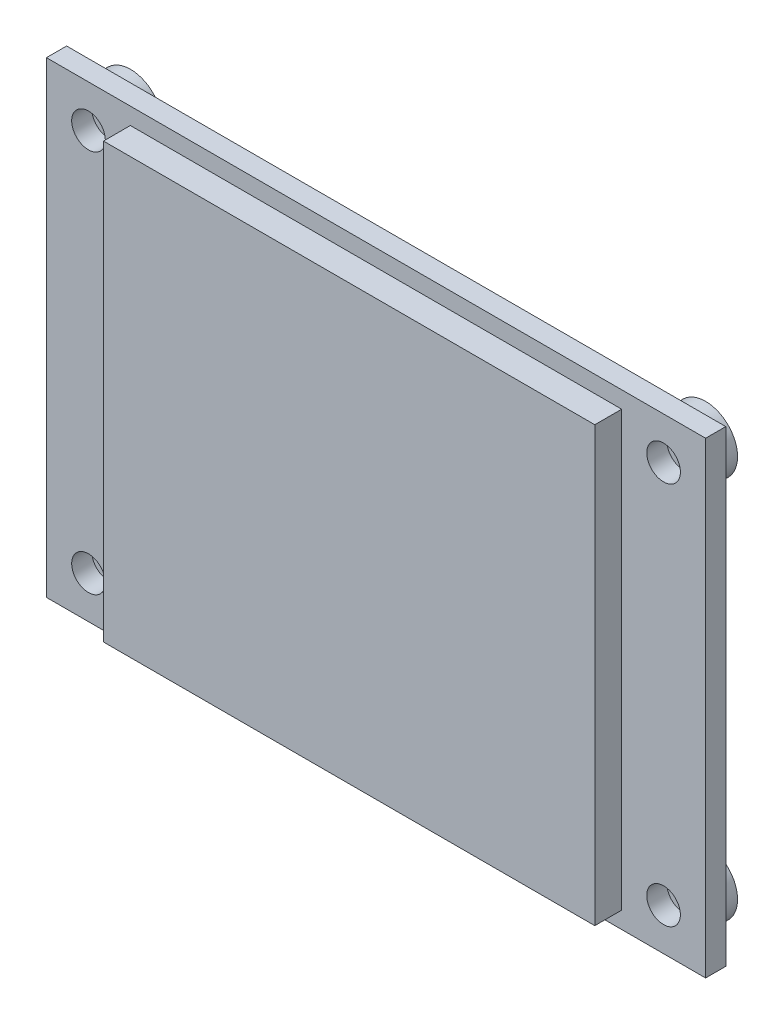
ISO-10303-21;
HEADER;
FILE_DESCRIPTION(('STEP AP214'),'2;1');
FILE_NAME('part.step','',(''),(''),'','','');
FILE_SCHEMA(('AUTOMOTIVE_DESIGN { 1 0 10303 214 1 1 1 1 }'));
ENDSEC;
DATA;
#1=APPLICATION_CONTEXT('core data for automotive mechanical design processes');
#2=APPLICATION_PROTOCOL_DEFINITION('international standard','automotive_design',2000,#1);
#3=PRODUCT_CONTEXT('',#1,'mechanical');
#4=PRODUCT('Part','Part','',(#3));
#5=PRODUCT_RELATED_PRODUCT_CATEGORY('part','',(#4));
#6=PRODUCT_DEFINITION_FORMATION('','',#4);
#7=PRODUCT_DEFINITION_CONTEXT('part definition',#1,'design');
#8=PRODUCT_DEFINITION('design','',#6,#7);
#9=PRODUCT_DEFINITION_SHAPE('','',#8);
#10=(LENGTH_UNIT() NAMED_UNIT(*) SI_UNIT(.MILLI.,.METRE.));
#11=(NAMED_UNIT(*) PLANE_ANGLE_UNIT() SI_UNIT($,.RADIAN.));
#12=(NAMED_UNIT(*) SI_UNIT($,.STERADIAN.) SOLID_ANGLE_UNIT());
#13=UNCERTAINTY_MEASURE_WITH_UNIT(LENGTH_MEASURE(1.E-05),#10,'distance_accuracy_value','');
#14=(GEOMETRIC_REPRESENTATION_CONTEXT(3) GLOBAL_UNCERTAINTY_ASSIGNED_CONTEXT((#13)) GLOBAL_UNIT_ASSIGNED_CONTEXT((#10,
#11,#12)) REPRESENTATION_CONTEXT('',''));
#15=CARTESIAN_POINT('',(0.,0.,0.));
#16=DIRECTION('',(0.,0.,1.));
#17=DIRECTION('',(1.,0.,0.));
#18=AXIS2_PLACEMENT_3D('',#15,#16,#17);
#19=CARTESIAN_POINT('',(0.,0.,25.2));
#20=DIRECTION('',(0.,0.,1.));
#21=DIRECTION('',(1.,0.,0.));
#22=AXIS2_PLACEMENT_3D('',#19,#20,#21);
#23=PLANE('',#22);
#24=CARTESIAN_POINT('',(47.1,56.4,25.2));
#25=DIRECTION('',(0.,0.,1.));
#26=DIRECTION('',(1.,0.,0.));
#27=AXIS2_PLACEMENT_3D('',#24,#25,#26);
#28=CIRCLE('',#27,1.9);
#29=CARTESIAN_POINT('',(49.,56.4,25.2));
#30=VERTEX_POINT('',#29);
#31=EDGE_CURVE('E11',#30,#30,#28,.F.);
#32=ORIENTED_EDGE('',*,*,#31,.F.);
#33=EDGE_LOOP('',(#32));
#34=FACE_BOUND('',#33,.T.);
#35=CARTESIAN_POINT('',(47.1,33.6,25.2));
#36=DIRECTION('',(0.,0.,1.));
#37=DIRECTION('',(1.,0.,0.));
#38=AXIS2_PLACEMENT_3D('',#35,#36,#37);
#39=CIRCLE('',#38,1.9);
#40=CARTESIAN_POINT('',(49.,33.6,25.2));
#41=VERTEX_POINT('',#40);
#42=EDGE_CURVE('E47',#41,#41,#39,.F.);
#43=ORIENTED_EDGE('',*,*,#42,.F.);
#44=EDGE_LOOP('',(#43));
#45=FACE_BOUND('',#44,.T.);
#46=CARTESIAN_POINT('',(12.9,56.4,25.2));
#47=DIRECTION('',(0.,0.,1.));
#48=DIRECTION('',(1.,0.,0.));
#49=AXIS2_PLACEMENT_3D('',#46,#47,#48);
#50=CIRCLE('',#49,1.9);
#51=CARTESIAN_POINT('',(14.8,56.4,25.2));
#52=VERTEX_POINT('',#51);
#53=EDGE_CURVE('E242',#52,#52,#50,.F.);
#54=ORIENTED_EDGE('',*,*,#53,.F.);
#55=EDGE_LOOP('',(#54));
#56=FACE_BOUND('',#55,.T.);
#57=CARTESIAN_POINT('',(12.9,33.6,25.2));
#58=DIRECTION('',(0.,0.,1.));
#59=DIRECTION('',(1.,0.,0.));
#60=AXIS2_PLACEMENT_3D('',#57,#58,#59);
#61=CIRCLE('',#60,1.9);
#62=CARTESIAN_POINT('',(14.8,33.6,25.2));
#63=VERTEX_POINT('',#62);
#64=EDGE_CURVE('E227',#63,#63,#61,.F.);
#65=ORIENTED_EDGE('',*,*,#64,.F.);
#66=EDGE_LOOP('',(#65));
#67=FACE_BOUND('',#66,.T.);
#68=DIRECTION('',(0.,-1.,0.));
#69=VECTOR('',#68,1.);
#70=CARTESIAN_POINT('',(10.4,58.9,25.2));
#71=LINE('',#70,#69);
#72=CARTESIAN_POINT('',(10.4,58.9,25.2));
#73=VERTEX_POINT('',#72);
#74=CARTESIAN_POINT('',(10.4,31.1,25.2));
#75=VERTEX_POINT('',#74);
#76=EDGE_CURVE('E197',#73,#75,#71,.T.);
#77=ORIENTED_EDGE('',*,*,#76,.F.);
#78=DIRECTION('',(-1.,0.,0.));
#79=VECTOR('',#78,1.);
#80=CARTESIAN_POINT('',(49.6,58.9,25.2));
#81=LINE('',#80,#79);
#82=CARTESIAN_POINT('',(49.6,58.9,25.2));
#83=VERTEX_POINT('',#82);
#84=EDGE_CURVE('E202',#83,#73,#81,.T.);
#85=ORIENTED_EDGE('',*,*,#84,.F.);
#86=DIRECTION('',(0.,1.,0.));
#87=VECTOR('',#86,1.);
#88=CARTESIAN_POINT('',(49.6,31.1,25.2));
#89=LINE('',#88,#87);
#90=CARTESIAN_POINT('',(49.6,31.1,25.2));
#91=VERTEX_POINT('',#90);
#92=EDGE_CURVE('E213',#91,#83,#89,.T.);
#93=ORIENTED_EDGE('',*,*,#92,.F.);
#94=DIRECTION('',(1.,0.,0.));
#95=VECTOR('',#94,1.);
#96=CARTESIAN_POINT('',(10.4,31.1,25.2));
#97=LINE('',#96,#95);
#98=EDGE_CURVE('E211',#75,#91,#97,.T.);
#99=ORIENTED_EDGE('',*,*,#98,.F.);
#100=EDGE_LOOP('',(#77,#85,#93,#99));
#101=FACE_BOUND('',#100,.T.);
#102=DIRECTION('',(0.,-1.,0.));
#103=VECTOR('',#102,1.);
#104=CARTESIAN_POINT('',(11.63,53.89,25.2));
#105=LINE('',#104,#103);
#106=CARTESIAN_POINT('',(11.63,53.89,25.2));
#107=VERTEX_POINT('',#106);
#108=CARTESIAN_POINT('',(11.63,36.11,25.2));
#109=VERTEX_POINT('',#108);
#110=EDGE_CURVE('E54',#107,#109,#105,.T.);
#111=ORIENTED_EDGE('',*,*,#110,.T.);
#112=DIRECTION('',(1.,0.,0.));
#113=VECTOR('',#112,1.);
#114=CARTESIAN_POINT('',(11.63,36.11,25.2));
#115=LINE('',#114,#113);
#116=CARTESIAN_POINT('',(14.17,36.11,25.2));
#117=VERTEX_POINT('',#116);
#118=EDGE_CURVE('E58',#109,#117,#115,.T.);
#119=ORIENTED_EDGE('',*,*,#118,.T.);
#120=DIRECTION('',(0.,1.,0.));
#121=VECTOR('',#120,1.);
#122=CARTESIAN_POINT('',(14.17,36.11,25.2));
#123=LINE('',#122,#121);
#124=CARTESIAN_POINT('',(14.17,53.89,25.2));
#125=VERTEX_POINT('',#124);
#126=EDGE_CURVE('E124',#117,#125,#123,.T.);
#127=ORIENTED_EDGE('',*,*,#126,.T.);
#128=DIRECTION('',(-1.,0.,0.));
#129=VECTOR('',#128,1.);
#130=CARTESIAN_POINT('',(14.17,53.89,25.2));
#131=LINE('',#130,#129);
#132=EDGE_CURVE('E127',#125,#107,#131,.T.);
#133=ORIENTED_EDGE('',*,*,#132,.T.);
#134=EDGE_LOOP('',(#111,#119,#127,#133));
#135=FACE_BOUND('',#134,.T.);
#136=ADVANCED_FACE('F39',(#34,#45,#56,#67,#101,#135),#23,.F.);
#137=CARTESIAN_POINT('',(10.4,58.9,26.4));
#138=DIRECTION('',(1.,0.,0.));
#139=DIRECTION('',(0.,0.,-1.));
#140=AXIS2_PLACEMENT_3D('',#137,#138,#139);
#141=PLANE('',#140);
#142=ORIENTED_EDGE('',*,*,#76,.T.);
#143=DIRECTION('',(0.,0.,-1.));
#144=VECTOR('',#143,1.);
#145=CARTESIAN_POINT('',(10.4,31.1,26.4));
#146=LINE('',#145,#144);
#147=CARTESIAN_POINT('',(10.4,31.1,26.4));
#148=VERTEX_POINT('',#147);
#149=EDGE_CURVE('E224',#148,#75,#146,.T.);
#150=ORIENTED_EDGE('',*,*,#149,.F.);
#151=DIRECTION('',(0.,-1.,0.));
#152=VECTOR('',#151,1.);
#153=CARTESIAN_POINT('',(10.4,58.9,26.4));
#154=LINE('',#153,#152);
#155=CARTESIAN_POINT('',(10.4,58.9,26.4));
#156=VERTEX_POINT('',#155);
#157=EDGE_CURVE('E198',#156,#148,#154,.T.);
#158=ORIENTED_EDGE('',*,*,#157,.F.);
#159=DIRECTION('',(0.,0.,-1.));
#160=VECTOR('',#159,1.);
#161=CARTESIAN_POINT('',(10.4,58.9,26.4));
#162=LINE('',#161,#160);
#163=EDGE_CURVE('E208',#156,#73,#162,.T.);
#164=ORIENTED_EDGE('',*,*,#163,.T.);
#165=EDGE_LOOP('',(#142,#150,#158,#164));
#166=FACE_BOUND('',#165,.T.);
#167=ADVANCED_FACE('F41',(#166),#141,.F.);
#168=CARTESIAN_POINT('',(10.4,31.1,26.4));
#169=DIRECTION('',(0.,1.,0.));
#170=DIRECTION('',(0.,0.,1.));
#171=AXIS2_PLACEMENT_3D('',#168,#169,#170);
#172=PLANE('',#171);
#173=ORIENTED_EDGE('',*,*,#98,.T.);
#174=DIRECTION('',(0.,0.,-1.));
#175=VECTOR('',#174,1.);
#176=CARTESIAN_POINT('',(49.6,31.1,26.4));
#177=LINE('',#176,#175);
#178=CARTESIAN_POINT('',(49.6,31.1,26.4));
#179=VERTEX_POINT('',#178);
#180=EDGE_CURVE('E221',#179,#91,#177,.T.);
#181=ORIENTED_EDGE('',*,*,#180,.F.);
#182=DIRECTION('',(1.,0.,0.));
#183=VECTOR('',#182,1.);
#184=CARTESIAN_POINT('',(10.4,31.1,26.4));
#185=LINE('',#184,#183);
#186=EDGE_CURVE('E201',#148,#179,#185,.T.);
#187=ORIENTED_EDGE('',*,*,#186,.F.);
#188=ORIENTED_EDGE('',*,*,#149,.T.);
#189=EDGE_LOOP('',(#173,#181,#187,#188));
#190=FACE_BOUND('',#189,.T.);
#191=ADVANCED_FACE('F274',(#190),#172,.F.);
#192=CARTESIAN_POINT('',(49.6,31.1,26.4));
#193=DIRECTION('',(-1.,0.,0.));
#194=DIRECTION('',(0.,0.,1.));
#195=AXIS2_PLACEMENT_3D('',#192,#193,#194);
#196=PLANE('',#195);
#197=ORIENTED_EDGE('',*,*,#92,.T.);
#198=DIRECTION('',(0.,0.,-1.));
#199=VECTOR('',#198,1.);
#200=CARTESIAN_POINT('',(49.6,58.9,26.4));
#201=LINE('',#200,#199);
#202=CARTESIAN_POINT('',(49.6,58.9,26.4));
#203=VERTEX_POINT('',#202);
#204=EDGE_CURVE('E218',#203,#83,#201,.T.);
#205=ORIENTED_EDGE('',*,*,#204,.F.);
#206=DIRECTION('',(0.,1.,0.));
#207=VECTOR('',#206,1.);
#208=CARTESIAN_POINT('',(49.6,31.1,26.4));
#209=LINE('',#208,#207);
#210=EDGE_CURVE('E204',#179,#203,#209,.T.);
#211=ORIENTED_EDGE('',*,*,#210,.F.);
#212=ORIENTED_EDGE('',*,*,#180,.T.);
#213=EDGE_LOOP('',(#197,#205,#211,#212));
#214=FACE_BOUND('',#213,.T.);
#215=ADVANCED_FACE('F271',(#214),#196,.F.);
#216=CARTESIAN_POINT('',(49.6,58.9,26.4));
#217=DIRECTION('',(0.,-1.,0.));
#218=DIRECTION('',(0.,0.,-1.));
#219=AXIS2_PLACEMENT_3D('',#216,#217,#218);
#220=PLANE('',#219);
#221=ORIENTED_EDGE('',*,*,#84,.T.);
#222=ORIENTED_EDGE('',*,*,#163,.F.);
#223=DIRECTION('',(-1.,0.,0.));
#224=VECTOR('',#223,1.);
#225=CARTESIAN_POINT('',(49.6,58.9,26.4));
#226=LINE('',#225,#224);
#227=EDGE_CURVE('E206',#203,#156,#226,.T.);
#228=ORIENTED_EDGE('',*,*,#227,.F.);
#229=ORIENTED_EDGE('',*,*,#204,.T.);
#230=EDGE_LOOP('',(#221,#222,#228,#229));
#231=FACE_BOUND('',#230,.T.);
#232=ADVANCED_FACE('F267',(#231),#220,.F.);
#233=CARTESIAN_POINT('',(0.,0.,26.4));
#234=DIRECTION('',(0.,0.,1.));
#235=DIRECTION('',(1.,0.,0.));
#236=AXIS2_PLACEMENT_3D('',#233,#234,#235);
#237=PLANE('',#236);
#238=CARTESIAN_POINT('',(12.9,56.4,26.4));
#239=DIRECTION('',(0.,0.,1.));
#240=DIRECTION('',(1.,0.,0.));
#241=AXIS2_PLACEMENT_3D('',#238,#239,#240);
#242=CIRCLE('',#241,0.999999999999999);
#243=CARTESIAN_POINT('',(13.9,56.4,26.4));
#244=VERTEX_POINT('',#243);
#245=EDGE_CURVE('E152',#244,#244,#242,.F.);
#246=ORIENTED_EDGE('',*,*,#245,.T.);
#247=EDGE_LOOP('',(#246));
#248=FACE_BOUND('',#247,.T.);
#249=CARTESIAN_POINT('',(47.1,33.6,26.4));
#250=DIRECTION('',(0.,0.,1.));
#251=DIRECTION('',(1.,0.,0.));
#252=AXIS2_PLACEMENT_3D('',#249,#250,#251);
#253=CIRCLE('',#252,1.);
#254=CARTESIAN_POINT('',(48.1,33.6,26.4));
#255=VERTEX_POINT('',#254);
#256=EDGE_CURVE('E235',#255,#255,#253,.F.);
#257=ORIENTED_EDGE('',*,*,#256,.T.);
#258=EDGE_LOOP('',(#257));
#259=FACE_BOUND('',#258,.T.);
#260=CARTESIAN_POINT('',(47.1,56.4,26.4));
#261=DIRECTION('',(0.,0.,1.));
#262=DIRECTION('',(1.,0.,0.));
#263=AXIS2_PLACEMENT_3D('',#260,#261,#262);
#264=CIRCLE('',#263,1.);
#265=CARTESIAN_POINT('',(48.1,56.4,26.4));
#266=VERTEX_POINT('',#265);
#267=EDGE_CURVE('E231',#266,#266,#264,.F.);
#268=ORIENTED_EDGE('',*,*,#267,.T.);
#269=EDGE_LOOP('',(#268));
#270=FACE_BOUND('',#269,.T.);
#271=CARTESIAN_POINT('',(12.9,33.6,26.4));
#272=DIRECTION('',(0.,0.,1.));
#273=DIRECTION('',(1.,0.,0.));
#274=AXIS2_PLACEMENT_3D('',#271,#272,#273);
#275=CIRCLE('',#274,0.999999999999999);
#276=CARTESIAN_POINT('',(13.9,33.6,26.4));
#277=VERTEX_POINT('',#276);
#278=EDGE_CURVE('E228',#277,#277,#275,.F.);
#279=ORIENTED_EDGE('',*,*,#278,.T.);
#280=EDGE_LOOP('',(#279));
#281=FACE_BOUND('',#280,.T.);
#282=DIRECTION('',(0.,-1.,0.));
#283=VECTOR('',#282,1.);
#284=CARTESIAN_POINT('',(15.39,57.9,26.4));
#285=LINE('',#284,#283);
#286=CARTESIAN_POINT('',(15.39,57.9,26.4));
#287=VERTEX_POINT('',#286);
#288=CARTESIAN_POINT('',(15.39,32.1,26.4));
#289=VERTEX_POINT('',#288);
#290=EDGE_CURVE('E173',#287,#289,#285,.T.);
#291=ORIENTED_EDGE('',*,*,#290,.F.);
#292=DIRECTION('',(-1.,0.,0.));
#293=VECTOR('',#292,1.);
#294=CARTESIAN_POINT('',(44.61,57.9,26.4));
#295=LINE('',#294,#293);
#296=CARTESIAN_POINT('',(44.61,57.9,26.4));
#297=VERTEX_POINT('',#296);
#298=EDGE_CURVE('E182',#297,#287,#295,.T.);
#299=ORIENTED_EDGE('',*,*,#298,.F.);
#300=DIRECTION('',(0.,1.,0.));
#301=VECTOR('',#300,1.);
#302=CARTESIAN_POINT('',(44.61,32.1,26.4));
#303=LINE('',#302,#301);
#304=CARTESIAN_POINT('',(44.61,32.1,26.4));
#305=VERTEX_POINT('',#304);
#306=EDGE_CURVE('E179',#305,#297,#303,.T.);
#307=ORIENTED_EDGE('',*,*,#306,.F.);
#308=DIRECTION('',(1.,0.,0.));
#309=VECTOR('',#308,1.);
#310=CARTESIAN_POINT('',(15.39,32.1,26.4));
#311=LINE('',#310,#309);
#312=EDGE_CURVE('E176',#289,#305,#311,.T.);
#313=ORIENTED_EDGE('',*,*,#312,.F.);
#314=EDGE_LOOP('',(#291,#299,#307,#313));
#315=FACE_BOUND('',#314,.T.);
#316=ORIENTED_EDGE('',*,*,#157,.T.);
#317=ORIENTED_EDGE('',*,*,#186,.T.);
#318=ORIENTED_EDGE('',*,*,#210,.T.);
#319=ORIENTED_EDGE('',*,*,#227,.T.);
#320=EDGE_LOOP('',(#316,#317,#318,#319));
#321=FACE_BOUND('',#320,.T.);
#322=ADVANCED_FACE('F276',(#248,#259,#270,#281,#315,#321),#237,.T.);
#323=CARTESIAN_POINT('',(15.39,57.9,27.4));
#324=DIRECTION('',(1.,0.,0.));
#325=DIRECTION('',(0.,0.,-1.));
#326=AXIS2_PLACEMENT_3D('',#323,#324,#325);
#327=PLANE('',#326);
#328=ORIENTED_EDGE('',*,*,#290,.T.);
#329=DIRECTION('',(0.,0.,-1.));
#330=VECTOR('',#329,1.);
#331=CARTESIAN_POINT('',(15.39,32.1,27.4));
#332=LINE('',#331,#330);
#333=CARTESIAN_POINT('',(15.39,32.1,28.));
#334=VERTEX_POINT('',#333);
#335=EDGE_CURVE('E194',#334,#289,#332,.T.);
#336=ORIENTED_EDGE('',*,*,#335,.F.);
#337=DIRECTION('',(0.,-1.,0.));
#338=VECTOR('',#337,1.);
#339=CARTESIAN_POINT('',(15.39,57.9,28.));
#340=LINE('',#339,#338);
#341=CARTESIAN_POINT('',(15.39,57.9,28.));
#342=VERTEX_POINT('',#341);
#343=EDGE_CURVE('E161',#342,#334,#340,.T.);
#344=ORIENTED_EDGE('',*,*,#343,.F.);
#345=DIRECTION('',(0.,0.,-1.));
#346=VECTOR('',#345,1.);
#347=CARTESIAN_POINT('',(15.39,57.9,27.4));
#348=LINE('',#347,#346);
#349=EDGE_CURVE('E185',#342,#287,#348,.T.);
#350=ORIENTED_EDGE('',*,*,#349,.T.);
#351=EDGE_LOOP('',(#328,#336,#344,#350));
#352=FACE_BOUND('',#351,.T.);
#353=ADVANCED_FACE('F278',(#352),#327,.F.);
#354=CARTESIAN_POINT('',(15.39,32.1,27.4));
#355=DIRECTION('',(0.,1.,0.));
#356=DIRECTION('',(0.,0.,1.));
#357=AXIS2_PLACEMENT_3D('',#354,#355,#356);
#358=PLANE('',#357);
#359=ORIENTED_EDGE('',*,*,#312,.T.);
#360=DIRECTION('',(0.,0.,-1.));
#361=VECTOR('',#360,1.);
#362=CARTESIAN_POINT('',(44.61,32.1,27.4));
#363=LINE('',#362,#361);
#364=CARTESIAN_POINT('',(44.61,32.1,28.));
#365=VERTEX_POINT('',#364);
#366=EDGE_CURVE('E191',#365,#305,#363,.T.);
#367=ORIENTED_EDGE('',*,*,#366,.F.);
#368=DIRECTION('',(1.,0.,0.));
#369=VECTOR('',#368,1.);
#370=CARTESIAN_POINT('',(15.39,32.1,28.));
#371=LINE('',#370,#369);
#372=EDGE_CURVE('E164',#334,#365,#371,.T.);
#373=ORIENTED_EDGE('',*,*,#372,.F.);
#374=ORIENTED_EDGE('',*,*,#335,.T.);
#375=EDGE_LOOP('',(#359,#367,#373,#374));
#376=FACE_BOUND('',#375,.T.);
#377=ADVANCED_FACE('F285',(#376),#358,.F.);
#378=CARTESIAN_POINT('',(44.61,32.1,27.4));
#379=DIRECTION('',(-1.,0.,0.));
#380=DIRECTION('',(0.,0.,1.));
#381=AXIS2_PLACEMENT_3D('',#378,#379,#380);
#382=PLANE('',#381);
#383=ORIENTED_EDGE('',*,*,#306,.T.);
#384=DIRECTION('',(0.,0.,-1.));
#385=VECTOR('',#384,1.);
#386=CARTESIAN_POINT('',(44.61,57.9,27.4));
#387=LINE('',#386,#385);
#388=CARTESIAN_POINT('',(44.61,57.9,28.));
#389=VERTEX_POINT('',#388);
#390=EDGE_CURVE('E188',#389,#297,#387,.T.);
#391=ORIENTED_EDGE('',*,*,#390,.F.);
#392=DIRECTION('',(0.,1.,0.));
#393=VECTOR('',#392,1.);
#394=CARTESIAN_POINT('',(44.61,32.1,28.));
#395=LINE('',#394,#393);
#396=EDGE_CURVE('E167',#365,#389,#395,.T.);
#397=ORIENTED_EDGE('',*,*,#396,.F.);
#398=ORIENTED_EDGE('',*,*,#366,.T.);
#399=EDGE_LOOP('',(#383,#391,#397,#398));
#400=FACE_BOUND('',#399,.T.);
#401=ADVANCED_FACE('F541',(#400),#382,.F.);
#402=CARTESIAN_POINT('',(44.61,57.9,27.4));
#403=DIRECTION('',(0.,-1.,0.));
#404=DIRECTION('',(0.,0.,-1.));
#405=AXIS2_PLACEMENT_3D('',#402,#403,#404);
#406=PLANE('',#405);
#407=ORIENTED_EDGE('',*,*,#298,.T.);
#408=ORIENTED_EDGE('',*,*,#349,.F.);
#409=DIRECTION('',(-1.,0.,0.));
#410=VECTOR('',#409,1.);
#411=CARTESIAN_POINT('',(44.61,57.9,28.));
#412=LINE('',#411,#410);
#413=EDGE_CURVE('E170',#389,#342,#412,.T.);
#414=ORIENTED_EDGE('',*,*,#413,.F.);
#415=ORIENTED_EDGE('',*,*,#390,.T.);
#416=EDGE_LOOP('',(#407,#408,#414,#415));
#417=FACE_BOUND('',#416,.T.);
#418=ADVANCED_FACE('F529',(#417),#406,.F.);
#419=CARTESIAN_POINT('',(0.,0.,28.));
#420=DIRECTION('',(0.,0.,1.));
#421=DIRECTION('',(1.,0.,0.));
#422=AXIS2_PLACEMENT_3D('',#419,#420,#421);
#423=PLANE('',#422);
#424=ORIENTED_EDGE('',*,*,#343,.T.);
#425=ORIENTED_EDGE('',*,*,#372,.T.);
#426=ORIENTED_EDGE('',*,*,#396,.T.);
#427=ORIENTED_EDGE('',*,*,#413,.T.);
#428=EDGE_LOOP('',(#424,#425,#426,#427));
#429=FACE_BOUND('',#428,.T.);
#430=ADVANCED_FACE('F514',(#429),#423,.T.);
#431=CARTESIAN_POINT('',(11.63,53.89,25.2));
#432=DIRECTION('',(1.,0.,0.));
#433=DIRECTION('',(0.,0.,-1.));
#434=AXIS2_PLACEMENT_3D('',#431,#432,#433);
#435=PLANE('',#434);
#436=DIRECTION('',(0.,-1.,0.));
#437=VECTOR('',#436,1.);
#438=CARTESIAN_POINT('',(11.63,53.89,22.66));
#439=LINE('',#438,#437);
#440=CARTESIAN_POINT('',(11.63,53.89,22.66));
#441=VERTEX_POINT('',#440);
#442=CARTESIAN_POINT('',(11.63,36.11,22.66));
#443=VERTEX_POINT('',#442);
#444=EDGE_CURVE('E148',#441,#443,#439,.T.);
#445=ORIENTED_EDGE('',*,*,#444,.T.);
#446=DIRECTION('',(0.,0.,-1.));
#447=VECTOR('',#446,1.);
#448=CARTESIAN_POINT('',(11.63,36.11,25.2));
#449=LINE('',#448,#447);
#450=EDGE_CURVE('E158',#109,#443,#449,.T.);
#451=ORIENTED_EDGE('',*,*,#450,.F.);
#452=ORIENTED_EDGE('',*,*,#110,.F.);
#453=DIRECTION('',(0.,0.,-1.));
#454=VECTOR('',#453,1.);
#455=CARTESIAN_POINT('',(11.63,53.89,25.2));
#456=LINE('',#455,#454);
#457=EDGE_CURVE('E140',#107,#441,#456,.T.);
#458=ORIENTED_EDGE('',*,*,#457,.T.);
#459=EDGE_LOOP('',(#445,#451,#452,#458));
#460=FACE_BOUND('',#459,.T.);
#461=ADVANCED_FACE('F505',(#460),#435,.F.);
#462=CARTESIAN_POINT('',(11.63,36.11,25.2));
#463=DIRECTION('',(0.,1.,0.));
#464=DIRECTION('',(0.,0.,1.));
#465=AXIS2_PLACEMENT_3D('',#462,#463,#464);
#466=PLANE('',#465);
#467=DIRECTION('',(1.,0.,0.));
#468=VECTOR('',#467,1.);
#469=CARTESIAN_POINT('',(11.63,36.11,22.66));
#470=LINE('',#469,#468);
#471=CARTESIAN_POINT('',(14.17,36.11,22.66));
#472=VERTEX_POINT('',#471);
#473=EDGE_CURVE('E151',#443,#472,#470,.T.);
#474=ORIENTED_EDGE('',*,*,#473,.T.);
#475=DIRECTION('',(0.,0.,-1.));
#476=VECTOR('',#475,1.);
#477=CARTESIAN_POINT('',(14.17,36.11,25.2));
#478=LINE('',#477,#476);
#479=EDGE_CURVE('E139',#117,#472,#478,.T.);
#480=ORIENTED_EDGE('',*,*,#479,.F.);
#481=ORIENTED_EDGE('',*,*,#118,.F.);
#482=ORIENTED_EDGE('',*,*,#450,.T.);
#483=EDGE_LOOP('',(#474,#480,#481,#482));
#484=FACE_BOUND('',#483,.T.);
#485=ADVANCED_FACE('F497',(#484),#466,.F.);
#486=CARTESIAN_POINT('',(14.17,36.11,25.2));
#487=DIRECTION('',(-1.,0.,0.));
#488=DIRECTION('',(0.,0.,1.));
#489=AXIS2_PLACEMENT_3D('',#486,#487,#488);
#490=PLANE('',#489);
#491=DIRECTION('',(0.,1.,0.));
#492=VECTOR('',#491,1.);
#493=CARTESIAN_POINT('',(14.17,36.11,22.66));
#494=LINE('',#493,#492);
#495=CARTESIAN_POINT('',(14.17,53.89,22.66));
#496=VERTEX_POINT('',#495);
#497=EDGE_CURVE('E136',#472,#496,#494,.T.);
#498=ORIENTED_EDGE('',*,*,#497,.T.);
#499=DIRECTION('',(0.,0.,-1.));
#500=VECTOR('',#499,1.);
#501=CARTESIAN_POINT('',(14.17,53.89,25.2));
#502=LINE('',#501,#500);
#503=EDGE_CURVE('E133',#125,#496,#502,.T.);
#504=ORIENTED_EDGE('',*,*,#503,.F.);
#505=ORIENTED_EDGE('',*,*,#126,.F.);
#506=ORIENTED_EDGE('',*,*,#479,.T.);
#507=EDGE_LOOP('',(#498,#504,#505,#506));
#508=FACE_BOUND('',#507,.T.);
#509=ADVANCED_FACE('F134',(#508),#490,.F.);
#510=CARTESIAN_POINT('',(14.17,53.89,25.2));
#511=DIRECTION('',(0.,-1.,0.));
#512=DIRECTION('',(0.,0.,-1.));
#513=AXIS2_PLACEMENT_3D('',#510,#511,#512);
#514=PLANE('',#513);
#515=DIRECTION('',(-1.,0.,0.));
#516=VECTOR('',#515,1.);
#517=CARTESIAN_POINT('',(14.17,53.89,22.66));
#518=LINE('',#517,#516);
#519=EDGE_CURVE('E155',#496,#441,#518,.T.);
#520=ORIENTED_EDGE('',*,*,#519,.T.);
#521=ORIENTED_EDGE('',*,*,#457,.F.);
#522=ORIENTED_EDGE('',*,*,#132,.F.);
#523=ORIENTED_EDGE('',*,*,#503,.T.);
#524=EDGE_LOOP('',(#520,#521,#522,#523));
#525=FACE_BOUND('',#524,.T.);
#526=ADVANCED_FACE('F142',(#525),#514,.F.);
#527=CARTESIAN_POINT('',(0.,0.,22.66));
#528=DIRECTION('',(0.,0.,1.));
#529=DIRECTION('',(1.,0.,0.));
#530=AXIS2_PLACEMENT_3D('',#527,#528,#529);
#531=PLANE('',#530);
#532=ORIENTED_EDGE('',*,*,#444,.F.);
#533=ORIENTED_EDGE('',*,*,#519,.F.);
#534=ORIENTED_EDGE('',*,*,#497,.F.);
#535=ORIENTED_EDGE('',*,*,#473,.F.);
#536=EDGE_LOOP('',(#532,#533,#534,#535));
#537=FACE_BOUND('',#536,.T.);
#538=ADVANCED_FACE('F470',(#537),#531,.F.);
#539=CARTESIAN_POINT('',(12.9,33.6,28.));
#540=DIRECTION('',(0.,0.,-1.));
#541=DIRECTION('',(-1.,0.,0.));
#542=AXIS2_PLACEMENT_3D('',#539,#540,#541);
#543=CYLINDRICAL_SURFACE('',#542,0.999999999999999);
#544=ORIENTED_EDGE('',*,*,#278,.F.);
#545=EDGE_LOOP('',(#544));
#546=FACE_BOUND('',#545,.T.);
#547=CARTESIAN_POINT('',(12.9,33.6,25.2));
#548=DIRECTION('',(0.,0.,1.));
#549=DIRECTION('',(1.,0.,0.));
#550=AXIS2_PLACEMENT_3D('',#547,#548,#549);
#551=CIRCLE('',#550,0.999999999999999);
#552=CARTESIAN_POINT('',(13.9,33.6,25.2));
#553=VERTEX_POINT('',#552);
#554=EDGE_CURVE('E232',#553,#553,#551,.T.);
#555=ORIENTED_EDGE('',*,*,#554,.F.);
#556=EDGE_LOOP('',(#555));
#557=FACE_BOUND('',#556,.T.);
#558=ADVANCED_FACE('F460',(#546,#557),#543,.F.);
#559=CARTESIAN_POINT('',(47.1,56.4,28.));
#560=DIRECTION('',(0.,0.,-1.));
#561=DIRECTION('',(-1.,0.,0.));
#562=AXIS2_PLACEMENT_3D('',#559,#560,#561);
#563=CYLINDRICAL_SURFACE('',#562,1.);
#564=ORIENTED_EDGE('',*,*,#267,.F.);
#565=EDGE_LOOP('',(#564));
#566=FACE_BOUND('',#565,.T.);
#567=CARTESIAN_POINT('',(47.1,56.4,25.2));
#568=DIRECTION('',(0.,0.,1.));
#569=DIRECTION('',(1.,0.,0.));
#570=AXIS2_PLACEMENT_3D('',#567,#568,#569);
#571=CIRCLE('',#570,1.);
#572=CARTESIAN_POINT('',(48.1,56.4,25.2));
#573=VERTEX_POINT('',#572);
#574=EDGE_CURVE('E679',#573,#573,#571,.T.);
#575=ORIENTED_EDGE('',*,*,#574,.F.);
#576=EDGE_LOOP('',(#575));
#577=FACE_BOUND('',#576,.T.);
#578=ADVANCED_FACE('F450',(#566,#577),#563,.F.);
#579=CARTESIAN_POINT('',(47.1,33.6,28.));
#580=DIRECTION('',(0.,0.,-1.));
#581=DIRECTION('',(-1.,0.,0.));
#582=AXIS2_PLACEMENT_3D('',#579,#580,#581);
#583=CYLINDRICAL_SURFACE('',#582,1.);
#584=ORIENTED_EDGE('',*,*,#256,.F.);
#585=EDGE_LOOP('',(#584));
#586=FACE_BOUND('',#585,.T.);
#587=CARTESIAN_POINT('',(47.1,33.6,25.2));
#588=DIRECTION('',(0.,0.,1.));
#589=DIRECTION('',(1.,0.,0.));
#590=AXIS2_PLACEMENT_3D('',#587,#588,#589);
#591=CIRCLE('',#590,1.);
#592=CARTESIAN_POINT('',(48.1,33.6,25.2));
#593=VERTEX_POINT('',#592);
#594=EDGE_CURVE('E673',#593,#593,#591,.T.);
#595=ORIENTED_EDGE('',*,*,#594,.F.);
#596=EDGE_LOOP('',(#595));
#597=FACE_BOUND('',#596,.T.);
#598=ADVANCED_FACE('F440',(#586,#597),#583,.F.);
#599=CARTESIAN_POINT('',(12.9,56.4,28.));
#600=DIRECTION('',(0.,0.,-1.));
#601=DIRECTION('',(-1.,0.,0.));
#602=AXIS2_PLACEMENT_3D('',#599,#600,#601);
#603=CYLINDRICAL_SURFACE('',#602,0.999999999999999);
#604=ORIENTED_EDGE('',*,*,#245,.F.);
#605=EDGE_LOOP('',(#604));
#606=FACE_BOUND('',#605,.T.);
#607=CARTESIAN_POINT('',(12.9,56.4,25.2));
#608=DIRECTION('',(0.,0.,1.));
#609=DIRECTION('',(1.,0.,0.));
#610=AXIS2_PLACEMENT_3D('',#607,#608,#609);
#611=CIRCLE('',#610,0.999999999999999);
#612=CARTESIAN_POINT('',(13.9,56.4,25.2));
#613=VERTEX_POINT('',#612);
#614=EDGE_CURVE('E667',#613,#613,#611,.T.);
#615=ORIENTED_EDGE('',*,*,#614,.F.);
#616=EDGE_LOOP('',(#615));
#617=FACE_BOUND('',#616,.T.);
#618=ADVANCED_FACE('F430',(#606,#617),#603,.F.);
#619=CARTESIAN_POINT('',(12.9,33.6,25.2));
#620=DIRECTION('',(0.,0.,1.));
#621=DIRECTION('',(1.,0.,0.));
#622=AXIS2_PLACEMENT_3D('',#619,#620,#621);
#623=PLANE('',#622);
#624=ORIENTED_EDGE('',*,*,#554,.T.);
#625=EDGE_LOOP('',(#624));
#626=FACE_BOUND('',#625,.T.);
#627=ADVANCED_FACE('F420',(#626),#623,.T.);
#628=CARTESIAN_POINT('',(12.9,33.6,25.2));
#629=DIRECTION('',(0.,0.,-1.));
#630=DIRECTION('',(-1.,0.,0.));
#631=AXIS2_PLACEMENT_3D('',#628,#629,#630);
#632=CYLINDRICAL_SURFACE('',#631,1.9);
#633=ORIENTED_EDGE('',*,*,#64,.T.);
#634=EDGE_LOOP('',(#633));
#635=FACE_BOUND('',#634,.T.);
#636=CARTESIAN_POINT('',(12.9,33.6,23.9));
#637=DIRECTION('',(0.,0.,1.));
#638=DIRECTION('',(1.,0.,0.));
#639=AXIS2_PLACEMENT_3D('',#636,#637,#638);
#640=CIRCLE('',#639,1.9);
#641=CARTESIAN_POINT('',(14.8,33.6,23.9));
#642=VERTEX_POINT('',#641);
#643=EDGE_CURVE('E664',#642,#642,#640,.T.);
#644=ORIENTED_EDGE('',*,*,#643,.T.);
#645=EDGE_LOOP('',(#644));
#646=FACE_BOUND('',#645,.T.);
#647=ADVANCED_FACE('F410',(#635,#646),#632,.T.);
#648=CARTESIAN_POINT('',(12.9,33.6,23.9));
#649=DIRECTION('',(0.,0.,1.));
#650=DIRECTION('',(1.,0.,0.));
#651=AXIS2_PLACEMENT_3D('',#648,#649,#650);
#652=PLANE('',#651);
#653=ORIENTED_EDGE('',*,*,#643,.F.);
#654=EDGE_LOOP('',(#653));
#655=FACE_BOUND('',#654,.T.);
#656=ADVANCED_FACE('F400',(#655),#652,.F.);
#657=CARTESIAN_POINT('',(12.9,56.4,25.2));
#658=DIRECTION('',(0.,0.,1.));
#659=DIRECTION('',(1.,0.,0.));
#660=AXIS2_PLACEMENT_3D('',#657,#658,#659);
#661=PLANE('',#660);
#662=ORIENTED_EDGE('',*,*,#614,.T.);
#663=EDGE_LOOP('',(#662));
#664=FACE_BOUND('',#663,.T.);
#665=ADVANCED_FACE('F390',(#664),#661,.T.);
#666=CARTESIAN_POINT('',(12.9,56.4,25.2));
#667=DIRECTION('',(0.,0.,-1.));
#668=DIRECTION('',(-1.,0.,0.));
#669=AXIS2_PLACEMENT_3D('',#666,#667,#668);
#670=CYLINDRICAL_SURFACE('',#669,1.9);
#671=ORIENTED_EDGE('',*,*,#53,.T.);
#672=EDGE_LOOP('',(#671));
#673=FACE_BOUND('',#672,.T.);
#674=CARTESIAN_POINT('',(12.9,56.4,23.9));
#675=DIRECTION('',(0.,0.,1.));
#676=DIRECTION('',(1.,0.,0.));
#677=AXIS2_PLACEMENT_3D('',#674,#675,#676);
#678=CIRCLE('',#677,1.9);
#679=CARTESIAN_POINT('',(14.8,56.4,23.9));
#680=VERTEX_POINT('',#679);
#681=EDGE_CURVE('E670',#680,#680,#678,.T.);
#682=ORIENTED_EDGE('',*,*,#681,.T.);
#683=EDGE_LOOP('',(#682));
#684=FACE_BOUND('',#683,.T.);
#685=ADVANCED_FACE('F380',(#673,#684),#670,.T.);
#686=CARTESIAN_POINT('',(12.9,56.4,23.9));
#687=DIRECTION('',(0.,0.,1.));
#688=DIRECTION('',(1.,0.,0.));
#689=AXIS2_PLACEMENT_3D('',#686,#687,#688);
#690=PLANE('',#689);
#691=ORIENTED_EDGE('',*,*,#681,.F.);
#692=EDGE_LOOP('',(#691));
#693=FACE_BOUND('',#692,.T.);
#694=ADVANCED_FACE('F370',(#693),#690,.F.);
#695=CARTESIAN_POINT('',(47.1,33.6,25.2));
#696=DIRECTION('',(0.,0.,1.));
#697=DIRECTION('',(1.,0.,0.));
#698=AXIS2_PLACEMENT_3D('',#695,#696,#697);
#699=PLANE('',#698);
#700=ORIENTED_EDGE('',*,*,#594,.T.);
#701=EDGE_LOOP('',(#700));
#702=FACE_BOUND('',#701,.T.);
#703=ADVANCED_FACE('F362',(#702),#699,.T.);
#704=CARTESIAN_POINT('',(47.1,33.6,25.2));
#705=DIRECTION('',(0.,0.,-1.));
#706=DIRECTION('',(-1.,0.,0.));
#707=AXIS2_PLACEMENT_3D('',#704,#705,#706);
#708=CYLINDRICAL_SURFACE('',#707,1.9);
#709=ORIENTED_EDGE('',*,*,#42,.T.);
#710=EDGE_LOOP('',(#709));
#711=FACE_BOUND('',#710,.T.);
#712=CARTESIAN_POINT('',(47.1,33.6,23.9));
#713=DIRECTION('',(0.,0.,1.));
#714=DIRECTION('',(1.,0.,0.));
#715=AXIS2_PLACEMENT_3D('',#712,#713,#714);
#716=CIRCLE('',#715,1.9);
#717=CARTESIAN_POINT('',(49.,33.6,23.9));
#718=VERTEX_POINT('',#717);
#719=EDGE_CURVE('E676',#718,#718,#716,.T.);
#720=ORIENTED_EDGE('',*,*,#719,.T.);
#721=EDGE_LOOP('',(#720));
#722=FACE_BOUND('',#721,.T.);
#723=ADVANCED_FACE('F247',(#711,#722),#708,.T.);
#724=CARTESIAN_POINT('',(47.1,33.6,23.9));
#725=DIRECTION('',(0.,0.,1.));
#726=DIRECTION('',(1.,0.,0.));
#727=AXIS2_PLACEMENT_3D('',#724,#725,#726);
#728=PLANE('',#727);
#729=ORIENTED_EDGE('',*,*,#719,.F.);
#730=EDGE_LOOP('',(#729));
#731=FACE_BOUND('',#730,.T.);
#732=ADVANCED_FACE('F311',(#731),#728,.F.);
#733=CARTESIAN_POINT('',(47.1,56.4,25.2));
#734=DIRECTION('',(0.,0.,1.));
#735=DIRECTION('',(1.,0.,0.));
#736=AXIS2_PLACEMENT_3D('',#733,#734,#735);
#737=PLANE('',#736);
#738=ORIENTED_EDGE('',*,*,#574,.T.);
#739=EDGE_LOOP('',(#738));
#740=FACE_BOUND('',#739,.T.);
#741=ADVANCED_FACE('F316',(#740),#737,.T.);
#742=CARTESIAN_POINT('',(47.1,56.4,25.2));
#743=DIRECTION('',(0.,0.,-1.));
#744=DIRECTION('',(-1.,0.,0.));
#745=AXIS2_PLACEMENT_3D('',#742,#743,#744);
#746=CYLINDRICAL_SURFACE('',#745,1.9);
#747=ORIENTED_EDGE('',*,*,#31,.T.);
#748=EDGE_LOOP('',(#747));
#749=FACE_BOUND('',#748,.T.);
#750=CARTESIAN_POINT('',(47.1,56.4,23.9));
#751=DIRECTION('',(0.,0.,1.));
#752=DIRECTION('',(1.,0.,0.));
#753=AXIS2_PLACEMENT_3D('',#750,#751,#752);
#754=CIRCLE('',#753,1.9);
#755=CARTESIAN_POINT('',(49.,56.4,23.9));
#756=VERTEX_POINT('',#755);
#757=EDGE_CURVE('E682',#756,#756,#754,.T.);
#758=ORIENTED_EDGE('',*,*,#757,.T.);
#759=EDGE_LOOP('',(#758));
#760=FACE_BOUND('',#759,.T.);
#761=ADVANCED_FACE('F321',(#749,#760),#746,.T.);
#762=CARTESIAN_POINT('',(47.1,56.4,23.9));
#763=DIRECTION('',(0.,0.,1.));
#764=DIRECTION('',(1.,0.,0.));
#765=AXIS2_PLACEMENT_3D('',#762,#763,#764);
#766=PLANE('',#765);
#767=ORIENTED_EDGE('',*,*,#757,.F.);
#768=EDGE_LOOP('',(#767));
#769=FACE_BOUND('',#768,.T.);
#770=ADVANCED_FACE('F332',(#769),#766,.F.);
#771=CLOSED_SHELL('',(#136,#167,#191,#215,#232,#322,#353,#377,#401,#418,#430,#461,#485,#509,
#526,#538,#558,#578,#598,#618,#627,#647,#656,#665,#685,#694,#703,#723,#732,#741,#761,#770));
#772=MANIFOLD_SOLID_BREP('B2',#771);
#773=ADVANCED_BREP_SHAPE_REPRESENTATION('',(#18,#772),#14);
#774=SHAPE_DEFINITION_REPRESENTATION(#9,#773);
ENDSEC;
END-ISO-10303-21;
